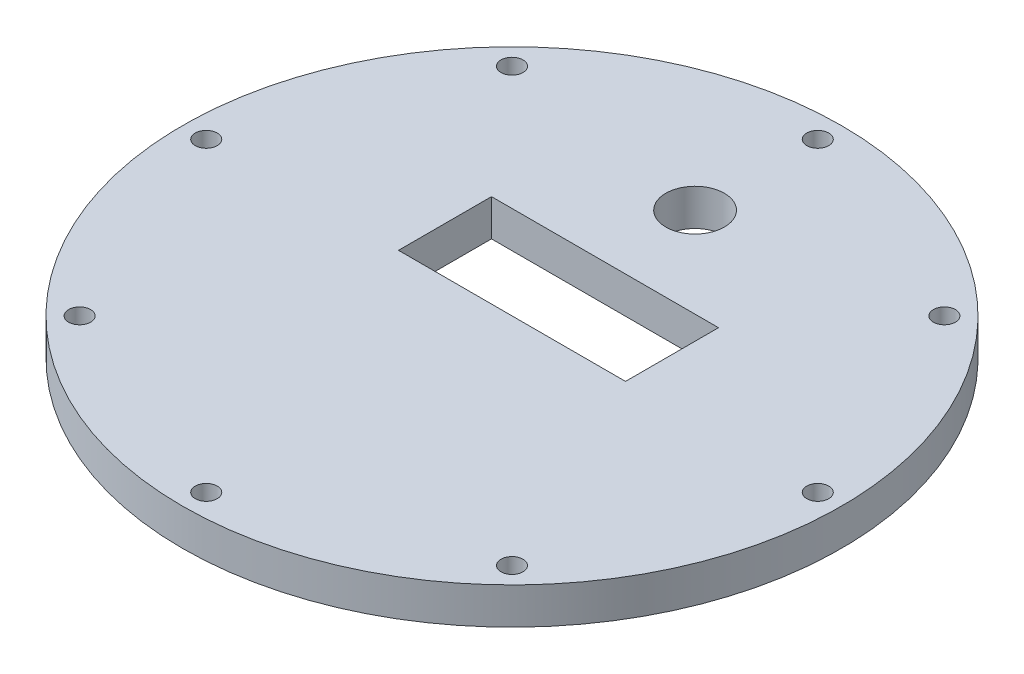
ISO-10303-21;
HEADER;
FILE_DESCRIPTION(('STEP AP214'),'2;1');
FILE_NAME('part.step','',(''),(''),'','','');
FILE_SCHEMA(('AUTOMOTIVE_DESIGN { 1 0 10303 214 1 1 1 1 }'));
ENDSEC;
DATA;
#1=APPLICATION_CONTEXT('core data for automotive mechanical design processes');
#2=APPLICATION_PROTOCOL_DEFINITION('international standard','automotive_design',2000,#1);
#3=PRODUCT_CONTEXT('',#1,'mechanical');
#4=PRODUCT('Part','Part','',(#3));
#5=PRODUCT_RELATED_PRODUCT_CATEGORY('part','',(#4));
#6=PRODUCT_DEFINITION_FORMATION('','',#4);
#7=PRODUCT_DEFINITION_CONTEXT('part definition',#1,'design');
#8=PRODUCT_DEFINITION('design','',#6,#7);
#9=PRODUCT_DEFINITION_SHAPE('','',#8);
#10=(LENGTH_UNIT() NAMED_UNIT(*) SI_UNIT(.MILLI.,.METRE.));
#11=(NAMED_UNIT(*) PLANE_ANGLE_UNIT() SI_UNIT($,.RADIAN.));
#12=(NAMED_UNIT(*) SI_UNIT($,.STERADIAN.) SOLID_ANGLE_UNIT());
#13=UNCERTAINTY_MEASURE_WITH_UNIT(LENGTH_MEASURE(1.E-05),#10,'distance_accuracy_value','');
#14=(GEOMETRIC_REPRESENTATION_CONTEXT(3) GLOBAL_UNCERTAINTY_ASSIGNED_CONTEXT((#13)) GLOBAL_UNIT_ASSIGNED_CONTEXT((#10,
#11,#12)) REPRESENTATION_CONTEXT('',''));
#15=CARTESIAN_POINT('',(0.,0.,0.));
#16=DIRECTION('',(0.,0.,1.));
#17=DIRECTION('',(1.,0.,0.));
#18=AXIS2_PLACEMENT_3D('',#15,#16,#17);
#19=CARTESIAN_POINT('',(0.,5.,0.));
#20=DIRECTION('',(0.,1.,0.));
#21=DIRECTION('',(0.,0.,1.));
#22=AXIS2_PLACEMENT_3D('',#19,#20,#21);
#23=PLANE('',#22);
#24=CARTESIAN_POINT('',(0.,5.,-25.));
#25=DIRECTION('',(0.,1.,0.));
#26=DIRECTION('',(0.,0.,1.));
#27=AXIS2_PLACEMENT_3D('',#24,#25,#26);
#28=CIRCLE('',#27,4.);
#29=CARTESIAN_POINT('',(0.,5.,-21.));
#30=VERTEX_POINT('',#29);
#31=EDGE_CURVE('E401',#30,#30,#28,.T.);
#32=ORIENTED_EDGE('',*,*,#31,.F.);
#33=EDGE_LOOP('',(#32));
#34=FACE_BOUND('',#33,.T.);
#35=DIRECTION('',(0.,0.,-1.));
#36=VECTOR('',#35,1.);
#37=CARTESIAN_POINT('',(15.5,5.,-12.7));
#38=LINE('',#37,#36);
#39=CARTESIAN_POINT('',(15.5,5.,0.));
#40=VERTEX_POINT('',#39);
#41=CARTESIAN_POINT('',(15.5,5.,-12.7));
#42=VERTEX_POINT('',#41);
#43=EDGE_CURVE('E62',#40,#42,#38,.T.);
#44=ORIENTED_EDGE('',*,*,#43,.F.);
#45=DIRECTION('',(1.,0.,0.));
#46=VECTOR('',#45,1.);
#47=CARTESIAN_POINT('',(-15.5,5.,0.));
#48=LINE('',#47,#46);
#49=CARTESIAN_POINT('',(-15.5,5.,0.));
#50=VERTEX_POINT('',#49);
#51=EDGE_CURVE('E108',#50,#40,#48,.T.);
#52=ORIENTED_EDGE('',*,*,#51,.F.);
#53=DIRECTION('',(0.,0.,1.));
#54=VECTOR('',#53,1.);
#55=CARTESIAN_POINT('',(-15.5,5.,-12.7));
#56=LINE('',#55,#54);
#57=CARTESIAN_POINT('',(-15.5,5.,-12.7));
#58=VERTEX_POINT('',#57);
#59=EDGE_CURVE('E91',#58,#50,#56,.T.);
#60=ORIENTED_EDGE('',*,*,#59,.F.);
#61=DIRECTION('',(-1.,0.,0.));
#62=VECTOR('',#61,1.);
#63=CARTESIAN_POINT('',(-15.5,5.,-12.7));
#64=LINE('',#63,#62);
#65=EDGE_CURVE('E101',#42,#58,#64,.T.);
#66=ORIENTED_EDGE('',*,*,#65,.F.);
#67=EDGE_LOOP('',(#44,#52,#60,#66));
#68=FACE_BOUND('',#67,.T.);
#69=CARTESIAN_POINT('',(-41.7499999999995,5.,7.55688533465481E-13));
#70=DIRECTION('',(0.,1.,0.));
#71=DIRECTION('',(0.,0.,1.));
#72=AXIS2_PLACEMENT_3D('',#69,#70,#71);
#73=CIRCLE('',#72,1.50000000000129);
#74=CARTESIAN_POINT('',(-41.7499999999995,5.,1.50000000000205));
#75=VERTEX_POINT('',#74);
#76=EDGE_CURVE('E131',#75,#75,#73,.T.);
#77=ORIENTED_EDGE('',*,*,#76,.F.);
#78=EDGE_LOOP('',(#77));
#79=FACE_BOUND('',#78,.T.);
#80=CARTESIAN_POINT('',(2.52321384578816E-12,5.,41.7500000000013));
#81=DIRECTION('',(0.,1.,0.));
#82=DIRECTION('',(0.,0.,1.));
#83=AXIS2_PLACEMENT_3D('',#80,#81,#82);
#84=CIRCLE('',#83,1.50000000000233);
#85=CARTESIAN_POINT('',(2.52321384578816E-12,5.,43.2500000000036));
#86=VERTEX_POINT('',#85);
#87=EDGE_CURVE('E147',#86,#86,#84,.T.);
#88=ORIENTED_EDGE('',*,*,#87,.F.);
#89=EDGE_LOOP('',(#88));
#90=FACE_BOUND('',#89,.T.);
#91=CARTESIAN_POINT('',(41.750000000003,5.,-7.50575633079041E-13));
#92=DIRECTION('',(0.,1.,0.));
#93=DIRECTION('',(0.,0.,1.));
#94=AXIS2_PLACEMENT_3D('',#91,#92,#93);
#95=CIRCLE('',#94,1.49999999999997);
#96=CARTESIAN_POINT('',(41.750000000003,5.,1.49999999999922));
#97=VERTEX_POINT('',#96);
#98=EDGE_CURVE('E163',#97,#97,#95,.T.);
#99=ORIENTED_EDGE('',*,*,#98,.F.);
#100=EDGE_LOOP('',(#99));
#101=FACE_BOUND('',#100,.T.);
#102=CARTESIAN_POINT('',(1.02206257963007E-12,5.,-41.7500000000013));
#103=DIRECTION('',(0.,1.,0.));
#104=DIRECTION('',(0.,0.,1.));
#105=AXIS2_PLACEMENT_3D('',#102,#103,#104);
#106=CIRCLE('',#105,1.49999999999866);
#107=CARTESIAN_POINT('',(1.02206257963007E-12,5.,-40.2500000000026));
#108=VERTEX_POINT('',#107);
#109=EDGE_CURVE('E179',#108,#108,#106,.T.);
#110=ORIENTED_EDGE('',*,*,#109,.F.);
#111=EDGE_LOOP('',(#110));
#112=FACE_BOUND('',#111,.T.);
#113=CARTESIAN_POINT('',(0.,5.,0.));
#114=DIRECTION('',(0.,1.,0.));
#115=DIRECTION('',(0.,0.,1.));
#116=AXIS2_PLACEMENT_3D('',#113,#114,#115);
#117=CIRCLE('',#116,45.);
#118=CARTESIAN_POINT('',(0.,5.,45.));
#119=VERTEX_POINT('',#118);
#120=EDGE_CURVE('E187',#119,#119,#117,.T.);
#121=ORIENTED_EDGE('',*,*,#120,.T.);
#122=EDGE_LOOP('',(#121));
#123=FACE_BOUND('',#122,.T.);
#124=CARTESIAN_POINT('',(29.5217081145405,5.,-29.5217081145398));
#125=DIRECTION('',(0.,1.,0.));
#126=DIRECTION('',(0.,0.,1.));
#127=AXIS2_PLACEMENT_3D('',#124,#125,#126);
#128=CIRCLE('',#127,1.49999999999886);
#129=CARTESIAN_POINT('',(29.5217081145405,5.,-28.0217081145409));
#130=VERTEX_POINT('',#129);
#131=EDGE_CURVE('E171',#130,#130,#128,.T.);
#132=ORIENTED_EDGE('',*,*,#131,.F.);
#133=EDGE_LOOP('',(#132));
#134=FACE_BOUND('',#133,.T.);
#135=CARTESIAN_POINT('',(29.5217081145415,5.,29.5217081145387));
#136=DIRECTION('',(0.,1.,0.));
#137=DIRECTION('',(0.,0.,1.));
#138=AXIS2_PLACEMENT_3D('',#135,#136,#137);
#139=CIRCLE('',#138,1.5000000000014);
#140=CARTESIAN_POINT('',(29.5217081145415,5.,31.0217081145401));
#141=VERTEX_POINT('',#140);
#142=EDGE_CURVE('E155',#141,#141,#139,.T.);
#143=ORIENTED_EDGE('',*,*,#142,.F.);
#144=EDGE_LOOP('',(#143));
#145=FACE_BOUND('',#144,.T.);
#146=CARTESIAN_POINT('',(-29.5217081145369,5.,29.5217081145398));
#147=DIRECTION('',(0.,1.,0.));
#148=DIRECTION('',(0.,0.,1.));
#149=AXIS2_PLACEMENT_3D('',#146,#147,#148);
#150=CIRCLE('',#149,1.50000000000227);
#151=CARTESIAN_POINT('',(-29.5217081145369,5.,31.021708114542));
#152=VERTEX_POINT('',#151);
#153=EDGE_CURVE('E139',#152,#152,#150,.T.);
#154=ORIENTED_EDGE('',*,*,#153,.F.);
#155=EDGE_LOOP('',(#154));
#156=FACE_BOUND('',#155,.T.);
#157=CARTESIAN_POINT('',(-29.521708114538,5.,-29.5217081145387));
#158=DIRECTION('',(0.,1.,0.));
#159=DIRECTION('',(0.,0.,1.));
#160=AXIS2_PLACEMENT_3D('',#157,#158,#159);
#161=CIRCLE('',#160,1.5);
#162=CARTESIAN_POINT('',(-29.521708114538,5.,-28.0217081145387));
#163=VERTEX_POINT('',#162);
#164=EDGE_CURVE('E123',#163,#163,#161,.T.);
#165=ORIENTED_EDGE('',*,*,#164,.F.);
#166=EDGE_LOOP('',(#165));
#167=FACE_BOUND('',#166,.T.);
#168=ADVANCED_FACE('F45',(#34,#68,#79,#90,#101,#112,#123,#134,#145,#156,#167),#23,.T.);
#169=CARTESIAN_POINT('',(0.,0.,0.));
#170=DIRECTION('',(0.,1.,0.));
#171=DIRECTION('',(0.,0.,1.));
#172=AXIS2_PLACEMENT_3D('',#169,#170,#171);
#173=PLANE('',#172);
#174=CARTESIAN_POINT('',(0.,0.,-25.));
#175=DIRECTION('',(0.,1.,0.));
#176=DIRECTION('',(0.,0.,1.));
#177=AXIS2_PLACEMENT_3D('',#174,#175,#176);
#178=CIRCLE('',#177,4.);
#179=CARTESIAN_POINT('',(0.,0.,-21.));
#180=VERTEX_POINT('',#179);
#181=EDGE_CURVE('E49',#180,#180,#178,.T.);
#182=ORIENTED_EDGE('',*,*,#181,.T.);
#183=EDGE_LOOP('',(#182));
#184=FACE_BOUND('',#183,.T.);
#185=DIRECTION('',(1.,0.,0.));
#186=VECTOR('',#185,1.);
#187=CARTESIAN_POINT('',(0.,0.,0.));
#188=LINE('',#187,#186);
#189=CARTESIAN_POINT('',(-15.5,0.,0.));
#190=VERTEX_POINT('',#189);
#191=CARTESIAN_POINT('',(15.5,0.,0.));
#192=VERTEX_POINT('',#191);
#193=EDGE_CURVE('E55',#190,#192,#188,.T.);
#194=ORIENTED_EDGE('',*,*,#193,.T.);
#195=DIRECTION('',(0.,0.,-1.));
#196=VECTOR('',#195,1.);
#197=CARTESIAN_POINT('',(15.5,0.,0.));
#198=LINE('',#197,#196);
#199=CARTESIAN_POINT('',(15.5,0.,-12.7));
#200=VERTEX_POINT('',#199);
#201=EDGE_CURVE('E11',#192,#200,#198,.T.);
#202=ORIENTED_EDGE('',*,*,#201,.T.);
#203=DIRECTION('',(-1.,0.,0.));
#204=VECTOR('',#203,1.);
#205=CARTESIAN_POINT('',(0.,0.,-12.7));
#206=LINE('',#205,#204);
#207=CARTESIAN_POINT('',(-15.5,0.,-12.7));
#208=VERTEX_POINT('',#207);
#209=EDGE_CURVE('E191',#200,#208,#206,.T.);
#210=ORIENTED_EDGE('',*,*,#209,.T.);
#211=DIRECTION('',(0.,0.,1.));
#212=VECTOR('',#211,1.);
#213=CARTESIAN_POINT('',(-15.5,0.,0.));
#214=LINE('',#213,#212);
#215=EDGE_CURVE('E94',#208,#190,#214,.T.);
#216=ORIENTED_EDGE('',*,*,#215,.T.);
#217=EDGE_LOOP('',(#194,#202,#210,#216));
#218=FACE_BOUND('',#217,.T.);
#219=CARTESIAN_POINT('',(0.,0.,0.));
#220=DIRECTION('',(0.,1.,0.));
#221=DIRECTION('',(0.,0.,1.));
#222=AXIS2_PLACEMENT_3D('',#219,#220,#221);
#223=CIRCLE('',#222,45.);
#224=CARTESIAN_POINT('',(0.,0.,45.));
#225=VERTEX_POINT('',#224);
#226=EDGE_CURVE('E183',#225,#225,#223,.T.);
#227=ORIENTED_EDGE('',*,*,#226,.F.);
#228=EDGE_LOOP('',(#227));
#229=FACE_BOUND('',#228,.T.);
#230=CARTESIAN_POINT('',(1.02206257963007E-12,0.,-41.7500000000013));
#231=DIRECTION('',(0.,1.,0.));
#232=DIRECTION('',(0.,0.,1.));
#233=AXIS2_PLACEMENT_3D('',#230,#231,#232);
#234=CIRCLE('',#233,1.49999999999866);
#235=CARTESIAN_POINT('',(1.02206257963007E-12,0.,-40.2500000000026));
#236=VERTEX_POINT('',#235);
#237=EDGE_CURVE('E175',#236,#236,#234,.T.);
#238=ORIENTED_EDGE('',*,*,#237,.T.);
#239=EDGE_LOOP('',(#238));
#240=FACE_BOUND('',#239,.T.);
#241=CARTESIAN_POINT('',(29.5217081145405,0.,-29.5217081145398));
#242=DIRECTION('',(0.,1.,0.));
#243=DIRECTION('',(0.,0.,1.));
#244=AXIS2_PLACEMENT_3D('',#241,#242,#243);
#245=CIRCLE('',#244,1.49999999999886);
#246=CARTESIAN_POINT('',(29.5217081145405,0.,-28.0217081145409));
#247=VERTEX_POINT('',#246);
#248=EDGE_CURVE('E167',#247,#247,#245,.T.);
#249=ORIENTED_EDGE('',*,*,#248,.T.);
#250=EDGE_LOOP('',(#249));
#251=FACE_BOUND('',#250,.T.);
#252=CARTESIAN_POINT('',(41.750000000003,0.,-7.50575633079041E-13));
#253=DIRECTION('',(0.,1.,0.));
#254=DIRECTION('',(0.,0.,1.));
#255=AXIS2_PLACEMENT_3D('',#252,#253,#254);
#256=CIRCLE('',#255,1.49999999999997);
#257=CARTESIAN_POINT('',(41.750000000003,0.,1.49999999999922));
#258=VERTEX_POINT('',#257);
#259=EDGE_CURVE('E159',#258,#258,#256,.T.);
#260=ORIENTED_EDGE('',*,*,#259,.T.);
#261=EDGE_LOOP('',(#260));
#262=FACE_BOUND('',#261,.T.);
#263=CARTESIAN_POINT('',(29.5217081145415,0.,29.5217081145387));
#264=DIRECTION('',(0.,1.,0.));
#265=DIRECTION('',(0.,0.,1.));
#266=AXIS2_PLACEMENT_3D('',#263,#264,#265);
#267=CIRCLE('',#266,1.5000000000014);
#268=CARTESIAN_POINT('',(29.5217081145415,0.,31.0217081145401));
#269=VERTEX_POINT('',#268);
#270=EDGE_CURVE('E151',#269,#269,#267,.T.);
#271=ORIENTED_EDGE('',*,*,#270,.T.);
#272=EDGE_LOOP('',(#271));
#273=FACE_BOUND('',#272,.T.);
#274=CARTESIAN_POINT('',(2.52321384578816E-12,0.,41.7500000000013));
#275=DIRECTION('',(0.,1.,0.));
#276=DIRECTION('',(0.,0.,1.));
#277=AXIS2_PLACEMENT_3D('',#274,#275,#276);
#278=CIRCLE('',#277,1.50000000000233);
#279=CARTESIAN_POINT('',(2.52321384578816E-12,0.,43.2500000000036));
#280=VERTEX_POINT('',#279);
#281=EDGE_CURVE('E143',#280,#280,#278,.T.);
#282=ORIENTED_EDGE('',*,*,#281,.T.);
#283=EDGE_LOOP('',(#282));
#284=FACE_BOUND('',#283,.T.);
#285=CARTESIAN_POINT('',(-29.5217081145369,0.,29.5217081145398));
#286=DIRECTION('',(0.,1.,0.));
#287=DIRECTION('',(0.,0.,1.));
#288=AXIS2_PLACEMENT_3D('',#285,#286,#287);
#289=CIRCLE('',#288,1.50000000000227);
#290=CARTESIAN_POINT('',(-29.5217081145369,0.,31.021708114542));
#291=VERTEX_POINT('',#290);
#292=EDGE_CURVE('E135',#291,#291,#289,.T.);
#293=ORIENTED_EDGE('',*,*,#292,.T.);
#294=EDGE_LOOP('',(#293));
#295=FACE_BOUND('',#294,.T.);
#296=CARTESIAN_POINT('',(-41.7499999999995,0.,7.55688533465481E-13));
#297=DIRECTION('',(0.,1.,0.));
#298=DIRECTION('',(0.,0.,1.));
#299=AXIS2_PLACEMENT_3D('',#296,#297,#298);
#300=CIRCLE('',#299,1.50000000000129);
#301=CARTESIAN_POINT('',(-41.7499999999995,0.,1.50000000000205));
#302=VERTEX_POINT('',#301);
#303=EDGE_CURVE('E127',#302,#302,#300,.T.);
#304=ORIENTED_EDGE('',*,*,#303,.T.);
#305=EDGE_LOOP('',(#304));
#306=FACE_BOUND('',#305,.T.);
#307=CARTESIAN_POINT('',(-29.521708114538,0.,-29.5217081145387));
#308=DIRECTION('',(0.,1.,0.));
#309=DIRECTION('',(0.,0.,1.));
#310=AXIS2_PLACEMENT_3D('',#307,#308,#309);
#311=CIRCLE('',#310,1.5);
#312=CARTESIAN_POINT('',(-29.521708114538,0.,-28.0217081145387));
#313=VERTEX_POINT('',#312);
#314=EDGE_CURVE('E118',#313,#313,#311,.T.);
#315=ORIENTED_EDGE('',*,*,#314,.T.);
#316=EDGE_LOOP('',(#315));
#317=FACE_BOUND('',#316,.T.);
#318=ADVANCED_FACE('F202',(#184,#218,#229,#240,#251,#262,#273,#284,#295,#306,#317),#173,.F.);
#319=CARTESIAN_POINT('',(0.,5.,0.));
#320=DIRECTION('',(0.,-1.,0.));
#321=DIRECTION('',(0.,0.,-1.));
#322=AXIS2_PLACEMENT_3D('',#319,#320,#321);
#323=CYLINDRICAL_SURFACE('',#322,45.);
#324=ORIENTED_EDGE('',*,*,#120,.F.);
#325=EDGE_LOOP('',(#324));
#326=FACE_BOUND('',#325,.T.);
#327=ORIENTED_EDGE('',*,*,#226,.T.);
#328=EDGE_LOOP('',(#327));
#329=FACE_BOUND('',#328,.T.);
#330=ADVANCED_FACE('F47',(#326,#329),#323,.T.);
#331=CARTESIAN_POINT('',(1.02206257963007E-12,5.,-41.7500000000013));
#332=DIRECTION('',(0.,-1.,0.));
#333=DIRECTION('',(0.,0.,-1.));
#334=AXIS2_PLACEMENT_3D('',#331,#332,#333);
#335=CYLINDRICAL_SURFACE('',#334,1.49999999999866);
#336=ORIENTED_EDGE('',*,*,#109,.T.);
#337=EDGE_LOOP('',(#336));
#338=FACE_BOUND('',#337,.T.);
#339=ORIENTED_EDGE('',*,*,#237,.F.);
#340=EDGE_LOOP('',(#339));
#341=FACE_BOUND('',#340,.T.);
#342=ADVANCED_FACE('F230',(#338,#341),#335,.F.);
#343=CARTESIAN_POINT('',(29.5217081145405,5.,-29.5217081145398));
#344=DIRECTION('',(0.,-1.,0.));
#345=DIRECTION('',(0.,0.,-1.));
#346=AXIS2_PLACEMENT_3D('',#343,#344,#345);
#347=CYLINDRICAL_SURFACE('',#346,1.49999999999886);
#348=ORIENTED_EDGE('',*,*,#131,.T.);
#349=EDGE_LOOP('',(#348));
#350=FACE_BOUND('',#349,.T.);
#351=ORIENTED_EDGE('',*,*,#248,.F.);
#352=EDGE_LOOP('',(#351));
#353=FACE_BOUND('',#352,.T.);
#354=ADVANCED_FACE('F233',(#350,#353),#347,.F.);
#355=CARTESIAN_POINT('',(41.750000000003,5.,-7.50575633079041E-13));
#356=DIRECTION('',(0.,-1.,0.));
#357=DIRECTION('',(0.,0.,-1.));
#358=AXIS2_PLACEMENT_3D('',#355,#356,#357);
#359=CYLINDRICAL_SURFACE('',#358,1.49999999999997);
#360=ORIENTED_EDGE('',*,*,#98,.T.);
#361=EDGE_LOOP('',(#360));
#362=FACE_BOUND('',#361,.T.);
#363=ORIENTED_EDGE('',*,*,#259,.F.);
#364=EDGE_LOOP('',(#363));
#365=FACE_BOUND('',#364,.T.);
#366=ADVANCED_FACE('F237',(#362,#365),#359,.F.);
#367=CARTESIAN_POINT('',(29.5217081145415,5.,29.5217081145387));
#368=DIRECTION('',(0.,-1.,0.));
#369=DIRECTION('',(0.,0.,-1.));
#370=AXIS2_PLACEMENT_3D('',#367,#368,#369);
#371=CYLINDRICAL_SURFACE('',#370,1.5000000000014);
#372=ORIENTED_EDGE('',*,*,#142,.T.);
#373=EDGE_LOOP('',(#372));
#374=FACE_BOUND('',#373,.T.);
#375=ORIENTED_EDGE('',*,*,#270,.F.);
#376=EDGE_LOOP('',(#375));
#377=FACE_BOUND('',#376,.T.);
#378=ADVANCED_FACE('F241',(#374,#377),#371,.F.);
#379=CARTESIAN_POINT('',(2.52321384578816E-12,5.,41.7500000000013));
#380=DIRECTION('',(0.,-1.,0.));
#381=DIRECTION('',(0.,0.,-1.));
#382=AXIS2_PLACEMENT_3D('',#379,#380,#381);
#383=CYLINDRICAL_SURFACE('',#382,1.50000000000233);
#384=ORIENTED_EDGE('',*,*,#87,.T.);
#385=EDGE_LOOP('',(#384));
#386=FACE_BOUND('',#385,.T.);
#387=ORIENTED_EDGE('',*,*,#281,.F.);
#388=EDGE_LOOP('',(#387));
#389=FACE_BOUND('',#388,.T.);
#390=ADVANCED_FACE('F245',(#386,#389),#383,.F.);
#391=CARTESIAN_POINT('',(-29.5217081145369,5.,29.5217081145398));
#392=DIRECTION('',(0.,-1.,0.));
#393=DIRECTION('',(0.,0.,-1.));
#394=AXIS2_PLACEMENT_3D('',#391,#392,#393);
#395=CYLINDRICAL_SURFACE('',#394,1.50000000000227);
#396=ORIENTED_EDGE('',*,*,#153,.T.);
#397=EDGE_LOOP('',(#396));
#398=FACE_BOUND('',#397,.T.);
#399=ORIENTED_EDGE('',*,*,#292,.F.);
#400=EDGE_LOOP('',(#399));
#401=FACE_BOUND('',#400,.T.);
#402=ADVANCED_FACE('F249',(#398,#401),#395,.F.);
#403=CARTESIAN_POINT('',(-41.7499999999995,5.,7.55688533465481E-13));
#404=DIRECTION('',(0.,-1.,0.));
#405=DIRECTION('',(0.,0.,-1.));
#406=AXIS2_PLACEMENT_3D('',#403,#404,#405);
#407=CYLINDRICAL_SURFACE('',#406,1.50000000000129);
#408=ORIENTED_EDGE('',*,*,#76,.T.);
#409=EDGE_LOOP('',(#408));
#410=FACE_BOUND('',#409,.T.);
#411=ORIENTED_EDGE('',*,*,#303,.F.);
#412=EDGE_LOOP('',(#411));
#413=FACE_BOUND('',#412,.T.);
#414=ADVANCED_FACE('F216',(#410,#413),#407,.F.);
#415=CARTESIAN_POINT('',(-29.521708114538,5.,-29.5217081145387));
#416=DIRECTION('',(0.,-1.,0.));
#417=DIRECTION('',(0.,0.,-1.));
#418=AXIS2_PLACEMENT_3D('',#415,#416,#417);
#419=CYLINDRICAL_SURFACE('',#418,1.5);
#420=ORIENTED_EDGE('',*,*,#164,.T.);
#421=EDGE_LOOP('',(#420));
#422=FACE_BOUND('',#421,.T.);
#423=ORIENTED_EDGE('',*,*,#314,.F.);
#424=EDGE_LOOP('',(#423));
#425=FACE_BOUND('',#424,.T.);
#426=ADVANCED_FACE('F209',(#422,#425),#419,.F.);
#427=CARTESIAN_POINT('',(15.5,-5.,-12.7));
#428=DIRECTION('',(1.,0.,0.));
#429=DIRECTION('',(0.,0.,-1.));
#430=AXIS2_PLACEMENT_3D('',#427,#428,#429);
#431=PLANE('',#430);
#432=DIRECTION('',(0.,1.,0.));
#433=VECTOR('',#432,1.);
#434=CARTESIAN_POINT('',(15.5,-5.,0.));
#435=LINE('',#434,#433);
#436=EDGE_CURVE('E115',#192,#40,#435,.T.);
#437=ORIENTED_EDGE('',*,*,#436,.T.);
#438=ORIENTED_EDGE('',*,*,#43,.T.);
#439=DIRECTION('',(0.,1.,0.));
#440=VECTOR('',#439,1.);
#441=CARTESIAN_POINT('',(15.5,-5.,-12.7));
#442=LINE('',#441,#440);
#443=EDGE_CURVE('E98',#200,#42,#442,.T.);
#444=ORIENTED_EDGE('',*,*,#443,.F.);
#445=ORIENTED_EDGE('',*,*,#201,.F.);
#446=EDGE_LOOP('',(#437,#438,#444,#445));
#447=FACE_BOUND('',#446,.T.);
#448=ADVANCED_FACE('F207',(#447),#431,.F.);
#449=CARTESIAN_POINT('',(-15.5,-5.,0.));
#450=DIRECTION('',(0.,0.,1.));
#451=DIRECTION('',(1.,0.,0.));
#452=AXIS2_PLACEMENT_3D('',#449,#450,#451);
#453=PLANE('',#452);
#454=DIRECTION('',(0.,1.,0.));
#455=VECTOR('',#454,1.);
#456=CARTESIAN_POINT('',(-15.5,-5.,0.));
#457=LINE('',#456,#455);
#458=EDGE_CURVE('E97',#190,#50,#457,.T.);
#459=ORIENTED_EDGE('',*,*,#458,.T.);
#460=ORIENTED_EDGE('',*,*,#51,.T.);
#461=ORIENTED_EDGE('',*,*,#436,.F.);
#462=ORIENTED_EDGE('',*,*,#193,.F.);
#463=EDGE_LOOP('',(#459,#460,#461,#462));
#464=FACE_BOUND('',#463,.T.);
#465=ADVANCED_FACE('F206',(#464),#453,.F.);
#466=CARTESIAN_POINT('',(-15.5,-5.,-12.7));
#467=DIRECTION('',(-1.,0.,0.));
#468=DIRECTION('',(0.,0.,1.));
#469=AXIS2_PLACEMENT_3D('',#466,#467,#468);
#470=PLANE('',#469);
#471=DIRECTION('',(0.,1.,0.));
#472=VECTOR('',#471,1.);
#473=CARTESIAN_POINT('',(-15.5,-5.,-12.7));
#474=LINE('',#473,#472);
#475=EDGE_CURVE('E70',#208,#58,#474,.T.);
#476=ORIENTED_EDGE('',*,*,#475,.T.);
#477=ORIENTED_EDGE('',*,*,#59,.T.);
#478=ORIENTED_EDGE('',*,*,#458,.F.);
#479=ORIENTED_EDGE('',*,*,#215,.F.);
#480=EDGE_LOOP('',(#476,#477,#478,#479));
#481=FACE_BOUND('',#480,.T.);
#482=ADVANCED_FACE('F88',(#481),#470,.F.);
#483=CARTESIAN_POINT('',(-15.5,-5.,-12.7));
#484=DIRECTION('',(0.,0.,-1.));
#485=DIRECTION('',(-1.,0.,0.));
#486=AXIS2_PLACEMENT_3D('',#483,#484,#485);
#487=PLANE('',#486);
#488=ORIENTED_EDGE('',*,*,#443,.T.);
#489=ORIENTED_EDGE('',*,*,#65,.T.);
#490=ORIENTED_EDGE('',*,*,#475,.F.);
#491=ORIENTED_EDGE('',*,*,#209,.F.);
#492=EDGE_LOOP('',(#488,#489,#490,#491));
#493=FACE_BOUND('',#492,.T.);
#494=ADVANCED_FACE('F102',(#493),#487,.F.);
#495=CARTESIAN_POINT('',(0.,-5.,-25.));
#496=DIRECTION('',(0.,1.,0.));
#497=DIRECTION('',(0.,0.,1.));
#498=AXIS2_PLACEMENT_3D('',#495,#496,#497);
#499=CYLINDRICAL_SURFACE('',#498,4.);
#500=ORIENTED_EDGE('',*,*,#31,.T.);
#501=EDGE_LOOP('',(#500));
#502=FACE_BOUND('',#501,.T.);
#503=ORIENTED_EDGE('',*,*,#181,.F.);
#504=EDGE_LOOP('',(#503));
#505=FACE_BOUND('',#504,.T.);
#506=ADVANCED_FACE('F373',(#502,#505),#499,.F.);
#507=CLOSED_SHELL('',(#168,#318,#330,#342,#354,#366,#378,#390,#402,#414,#426,#448,#465,#482,
#494,#506));
#508=MANIFOLD_SOLID_BREP('B2',#507);
#509=ADVANCED_BREP_SHAPE_REPRESENTATION('',(#18,#508),#14);
#510=SHAPE_DEFINITION_REPRESENTATION(#9,#509);
ENDSEC;
END-ISO-10303-21;
